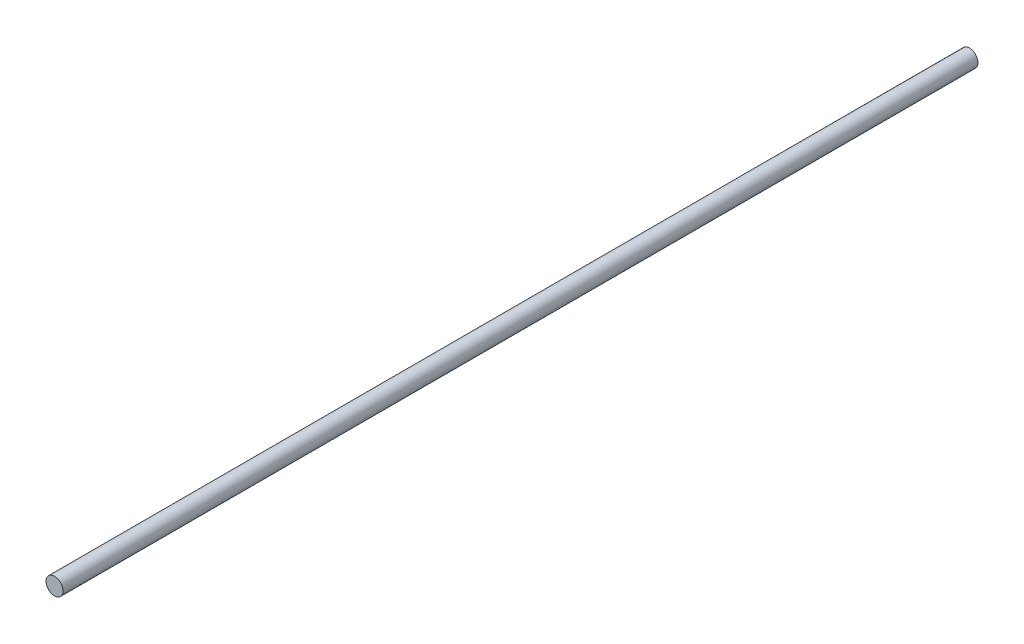
ISO-10303-21;
HEADER;
FILE_DESCRIPTION(('STEP AP214'),'2;1');
FILE_NAME('part.step','',(''),(''),'','','');
FILE_SCHEMA(('AUTOMOTIVE_DESIGN { 1 0 10303 214 1 1 1 1 }'));
ENDSEC;
DATA;
#1=APPLICATION_CONTEXT('core data for automotive mechanical design processes');
#2=APPLICATION_PROTOCOL_DEFINITION('international standard','automotive_design',2000,#1);
#3=PRODUCT_CONTEXT('',#1,'mechanical');
#4=PRODUCT('Part','Part','',(#3));
#5=PRODUCT_RELATED_PRODUCT_CATEGORY('part','',(#4));
#6=PRODUCT_DEFINITION_FORMATION('','',#4);
#7=PRODUCT_DEFINITION_CONTEXT('part definition',#1,'design');
#8=PRODUCT_DEFINITION('design','',#6,#7);
#9=PRODUCT_DEFINITION_SHAPE('','',#8);
#10=(LENGTH_UNIT() NAMED_UNIT(*) SI_UNIT(.MILLI.,.METRE.));
#11=(NAMED_UNIT(*) PLANE_ANGLE_UNIT() SI_UNIT($,.RADIAN.));
#12=(NAMED_UNIT(*) SI_UNIT($,.STERADIAN.) SOLID_ANGLE_UNIT());
#13=UNCERTAINTY_MEASURE_WITH_UNIT(LENGTH_MEASURE(1.E-05),#10,'distance_accuracy_value','');
#14=(GEOMETRIC_REPRESENTATION_CONTEXT(3) GLOBAL_UNCERTAINTY_ASSIGNED_CONTEXT((#13)) GLOBAL_UNIT_ASSIGNED_CONTEXT((#10,
#11,#12)) REPRESENTATION_CONTEXT('',''));
#15=CARTESIAN_POINT('',(0.,0.,0.));
#16=DIRECTION('',(0.,0.,1.));
#17=DIRECTION('',(1.,0.,0.));
#18=AXIS2_PLACEMENT_3D('',#15,#16,#17);
#19=CARTESIAN_POINT('',(0.,0.,430.));
#20=DIRECTION('',(0.,0.,-1.));
#21=DIRECTION('',(-1.,0.,0.));
#22=AXIS2_PLACEMENT_3D('',#19,#20,#21);
#23=CYLINDRICAL_SURFACE('',#22,4.);
#24=CARTESIAN_POINT('',(0.,0.,430.));
#25=DIRECTION('',(0.,0.,1.));
#26=DIRECTION('',(1.,0.,0.));
#27=AXIS2_PLACEMENT_3D('',#24,#25,#26);
#28=CIRCLE('',#27,4.);
#29=CARTESIAN_POINT('',(4.,0.,430.));
#30=VERTEX_POINT('',#29);
#31=EDGE_CURVE('E10',#30,#30,#28,.T.);
#32=ORIENTED_EDGE('',*,*,#31,.F.);
#33=EDGE_LOOP('',(#32));
#34=FACE_BOUND('',#33,.T.);
#35=CARTESIAN_POINT('',(0.,0.,0.));
#36=DIRECTION('',(0.,0.,1.));
#37=DIRECTION('',(1.,0.,0.));
#38=AXIS2_PLACEMENT_3D('',#35,#36,#37);
#39=CIRCLE('',#38,4.);
#40=CARTESIAN_POINT('',(4.,0.,0.));
#41=VERTEX_POINT('',#40);
#42=EDGE_CURVE('E40',#41,#41,#39,.T.);
#43=ORIENTED_EDGE('',*,*,#42,.T.);
#44=EDGE_LOOP('',(#43));
#45=FACE_BOUND('',#44,.T.);
#46=ADVANCED_FACE('F37',(#34,#45),#23,.T.);
#47=CARTESIAN_POINT('',(0.,0.,430.));
#48=DIRECTION('',(0.,0.,1.));
#49=DIRECTION('',(1.,0.,0.));
#50=AXIS2_PLACEMENT_3D('',#47,#48,#49);
#51=PLANE('',#50);
#52=ORIENTED_EDGE('',*,*,#31,.T.);
#53=EDGE_LOOP('',(#52));
#54=FACE_BOUND('',#53,.T.);
#55=ADVANCED_FACE('F54',(#54),#51,.T.);
#56=CARTESIAN_POINT('',(0.,0.,0.));
#57=DIRECTION('',(0.,0.,1.));
#58=DIRECTION('',(1.,0.,0.));
#59=AXIS2_PLACEMENT_3D('',#56,#57,#58);
#60=PLANE('',#59);
#61=ORIENTED_EDGE('',*,*,#42,.F.);
#62=EDGE_LOOP('',(#61));
#63=FACE_BOUND('',#62,.T.);
#64=ADVANCED_FACE('F52',(#63),#60,.F.);
#65=CLOSED_SHELL('',(#46,#55,#64));
#66=MANIFOLD_SOLID_BREP('B2',#65);
#67=ADVANCED_BREP_SHAPE_REPRESENTATION('',(#18,#66),#14);
#68=SHAPE_DEFINITION_REPRESENTATION(#9,#67);
ENDSEC;
END-ISO-10303-21;
